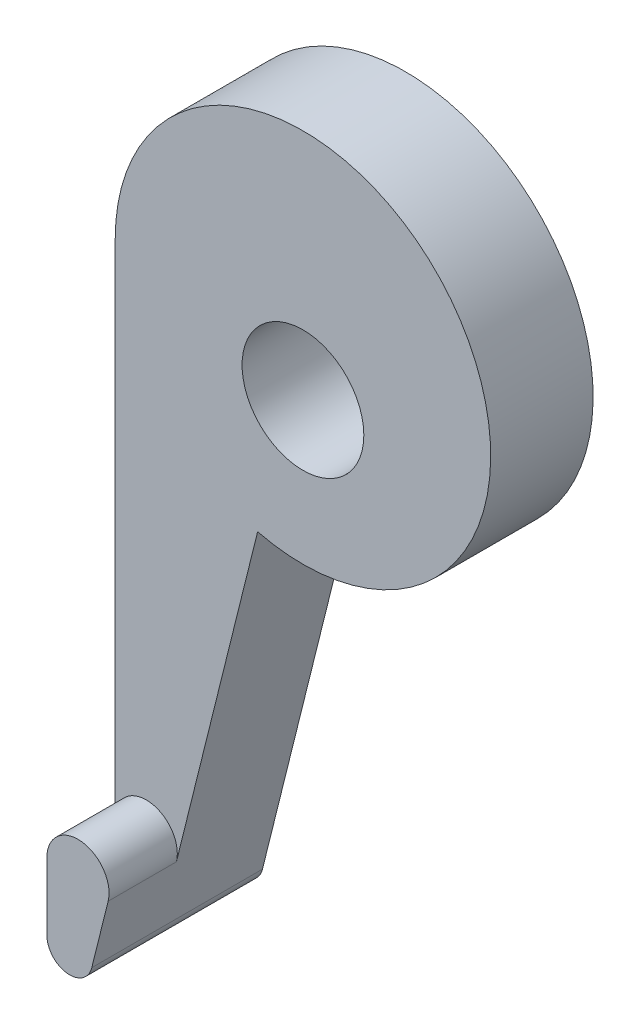
ISO-10303-21;
HEADER;
FILE_DESCRIPTION(('STEP AP214'),'2;1');
FILE_NAME('part.step','',(''),(''),'','','');
FILE_SCHEMA(('AUTOMOTIVE_DESIGN { 1 0 10303 214 1 1 1 1 }'));
ENDSEC;
DATA;
#1=APPLICATION_CONTEXT('core data for automotive mechanical design processes');
#2=APPLICATION_PROTOCOL_DEFINITION('international standard','automotive_design',2000,#1);
#3=PRODUCT_CONTEXT('',#1,'mechanical');
#4=PRODUCT('Part','Part','',(#3));
#5=PRODUCT_RELATED_PRODUCT_CATEGORY('part','',(#4));
#6=PRODUCT_DEFINITION_FORMATION('','',#4);
#7=PRODUCT_DEFINITION_CONTEXT('part definition',#1,'design');
#8=PRODUCT_DEFINITION('design','',#6,#7);
#9=PRODUCT_DEFINITION_SHAPE('','',#8);
#10=(LENGTH_UNIT() NAMED_UNIT(*) SI_UNIT(.MILLI.,.METRE.));
#11=(NAMED_UNIT(*) PLANE_ANGLE_UNIT() SI_UNIT($,.RADIAN.));
#12=(NAMED_UNIT(*) SI_UNIT($,.STERADIAN.) SOLID_ANGLE_UNIT());
#13=UNCERTAINTY_MEASURE_WITH_UNIT(LENGTH_MEASURE(1.E-05),#10,'distance_accuracy_value','');
#14=(GEOMETRIC_REPRESENTATION_CONTEXT(3) GLOBAL_UNCERTAINTY_ASSIGNED_CONTEXT((#13)) GLOBAL_UNIT_ASSIGNED_CONTEXT((#10,
#11,#12)) REPRESENTATION_CONTEXT('',''));
#15=CARTESIAN_POINT('',(0.,0.,0.));
#16=DIRECTION('',(0.,0.,1.));
#17=DIRECTION('',(1.,0.,0.));
#18=AXIS2_PLACEMENT_3D('',#15,#16,#17);
#19=CARTESIAN_POINT('',(9.58549901352955,8.51872549397017,4.5));
#20=DIRECTION('',(0.,0.,1.));
#21=DIRECTION('',(1.,0.,0.));
#22=AXIS2_PLACEMENT_3D('',#19,#20,#21);
#23=PLANE('',#22);
#24=CARTESIAN_POINT('',(2.70033985055056,-13.5035419519475,4.5));
#25=DIRECTION('',(0.,0.,1.));
#26=DIRECTION('',(-1.,0.,0.));
#27=AXIS2_PLACEMENT_3D('',#24,#25,#26);
#28=CIRCLE('',#27,1.36484083702101);
#29=CARTESIAN_POINT('',(4.02480904854268,-13.8330443858844,4.5));
#30=VERTEX_POINT('',#29);
#31=CARTESIAN_POINT('',(1.33549901352955,-13.5035419519475,4.5));
#32=VERTEX_POINT('',#31);
#33=EDGE_CURVE('E54',#30,#32,#28,.T.);
#34=ORIENTED_EDGE('',*,*,#33,.F.);
#35=DIRECTION('',(0.24142187499025,0.970420258587068,0.));
#36=VECTOR('',#35,1.);
#37=CARTESIAN_POINT('',(3.30591927211662,-16.7226963810201,4.5));
#38=LINE('',#37,#36);
#39=CARTESIAN_POINT('',(7.59376854485999,0.512758360626857,4.5));
#40=VERTEX_POINT('',#39);
#41=EDGE_CURVE('E59',#30,#40,#38,.T.);
#42=ORIENTED_EDGE('',*,*,#41,.T.);
#43=CARTESIAN_POINT('',(9.58549901352955,8.51872549397017,4.5));
#44=DIRECTION('',(0.,0.,1.));
#45=DIRECTION('',(1.,0.,0.));
#46=AXIS2_PLACEMENT_3D('',#43,#44,#45);
#47=CIRCLE('',#46,8.25);
#48=CARTESIAN_POINT('',(1.33549901352955,8.51872549397017,4.5));
#49=VERTEX_POINT('',#48);
#50=EDGE_CURVE('E90',#40,#49,#47,.T.);
#51=ORIENTED_EDGE('',*,*,#50,.T.);
#52=DIRECTION('',(0.,-1.,0.));
#53=VECTOR('',#52,1.);
#54=CARTESIAN_POINT('',(1.33549901352955,8.51872549397017,4.5));
#55=LINE('',#54,#53);
#56=EDGE_CURVE('E149',#49,#32,#55,.T.);
#57=ORIENTED_EDGE('',*,*,#56,.T.);
#58=EDGE_LOOP('',(#34,#42,#51,#57));
#59=FACE_BOUND('',#58,.T.);
#60=CARTESIAN_POINT('',(9.58549901352955,6.51872549397017,4.5));
#61=DIRECTION('',(0.,0.,1.));
#62=DIRECTION('',(1.,0.,0.));
#63=AXIS2_PLACEMENT_3D('',#60,#61,#62);
#64=CIRCLE('',#63,2.675);
#65=CARTESIAN_POINT('',(12.2604990135296,6.51872549397017,4.5));
#66=VERTEX_POINT('',#65);
#67=EDGE_CURVE('E101',#66,#66,#64,.T.);
#68=ORIENTED_EDGE('',*,*,#67,.F.);
#69=EDGE_LOOP('',(#68));
#70=FACE_BOUND('',#69,.T.);
#71=ADVANCED_FACE('F39',(#59,#70),#23,.T.);
#72=CARTESIAN_POINT('',(9.58549901352955,8.51872549397017,0.));
#73=DIRECTION('',(0.,0.,1.));
#74=DIRECTION('',(1.,0.,0.));
#75=AXIS2_PLACEMENT_3D('',#72,#73,#74);
#76=PLANE('',#75);
#77=CARTESIAN_POINT('',(9.58549901352955,8.51872549397017,0.));
#78=DIRECTION('',(0.,0.,1.));
#79=DIRECTION('',(1.,0.,0.));
#80=AXIS2_PLACEMENT_3D('',#77,#78,#79);
#81=CIRCLE('',#80,8.25);
#82=CARTESIAN_POINT('',(7.59376854485999,0.512758360626857,0.));
#83=VERTEX_POINT('',#82);
#84=CARTESIAN_POINT('',(1.33549901352955,8.51872549397017,0.));
#85=VERTEX_POINT('',#84);
#86=EDGE_CURVE('E96',#83,#85,#81,.T.);
#87=ORIENTED_EDGE('',*,*,#86,.F.);
#88=DIRECTION('',(0.24142187499025,0.970420258587068,0.));
#89=VECTOR('',#88,1.);
#90=CARTESIAN_POINT('',(3.30591927211662,-16.7226963810201,0.));
#91=LINE('',#90,#89);
#92=CARTESIAN_POINT('',(3.30591927211662,-16.7226963810201,0.));
#93=VERTEX_POINT('',#92);
#94=EDGE_CURVE('E79',#93,#83,#91,.T.);
#95=ORIENTED_EDGE('',*,*,#94,.F.);
#96=CARTESIAN_POINT('',(2.33549901352955,-16.4812745060298,0.));
#97=DIRECTION('',(0.,0.,1.));
#98=DIRECTION('',(1.,0.,0.));
#99=AXIS2_PLACEMENT_3D('',#96,#97,#98);
#100=CIRCLE('',#99,1.);
#101=CARTESIAN_POINT('',(1.33549901352955,-16.4812745060298,0.));
#102=VERTEX_POINT('',#101);
#103=EDGE_CURVE('E91',#102,#93,#100,.T.);
#104=ORIENTED_EDGE('',*,*,#103,.F.);
#105=DIRECTION('',(0.,-1.,0.));
#106=VECTOR('',#105,1.);
#107=CARTESIAN_POINT('',(1.33549901352955,8.51872549397017,0.));
#108=LINE('',#107,#106);
#109=EDGE_CURVE('E100',#85,#102,#108,.T.);
#110=ORIENTED_EDGE('',*,*,#109,.F.);
#111=EDGE_LOOP('',(#87,#95,#104,#110));
#112=FACE_BOUND('',#111,.T.);
#113=CARTESIAN_POINT('',(9.58549901352955,6.51872549397017,0.));
#114=DIRECTION('',(0.,0.,1.));
#115=DIRECTION('',(1.,0.,0.));
#116=AXIS2_PLACEMENT_3D('',#113,#114,#115);
#117=CIRCLE('',#116,2.675);
#118=CARTESIAN_POINT('',(12.2604990135296,6.51872549397017,0.));
#119=VERTEX_POINT('',#118);
#120=EDGE_CURVE('E105',#119,#119,#117,.T.);
#121=ORIENTED_EDGE('',*,*,#120,.T.);
#122=EDGE_LOOP('',(#121));
#123=FACE_BOUND('',#122,.T.);
#124=ADVANCED_FACE('F98',(#112,#123),#76,.F.);
#125=CARTESIAN_POINT('',(9.58549901352955,8.51872549397017,4.5));
#126=DIRECTION('',(0.,0.,-1.));
#127=DIRECTION('',(-1.,0.,0.));
#128=AXIS2_PLACEMENT_3D('',#125,#126,#127);
#129=CYLINDRICAL_SURFACE('',#128,8.25);
#130=ORIENTED_EDGE('',*,*,#86,.T.);
#131=DIRECTION('',(0.,0.,-1.));
#132=VECTOR('',#131,1.);
#133=CARTESIAN_POINT('',(1.33549901352955,8.51872549397017,4.5));
#134=LINE('',#133,#132);
#135=EDGE_CURVE('E11',#49,#85,#134,.T.);
#136=ORIENTED_EDGE('',*,*,#135,.F.);
#137=ORIENTED_EDGE('',*,*,#50,.F.);
#138=DIRECTION('',(0.,0.,-1.));
#139=VECTOR('',#138,1.);
#140=CARTESIAN_POINT('',(7.59376854485999,0.512758360626857,4.5));
#141=LINE('',#140,#139);
#142=EDGE_CURVE('E82',#40,#83,#141,.T.);
#143=ORIENTED_EDGE('',*,*,#142,.T.);
#144=EDGE_LOOP('',(#130,#136,#137,#143));
#145=FACE_BOUND('',#144,.T.);
#146=ADVANCED_FACE('F41',(#145),#129,.T.);
#147=CARTESIAN_POINT('',(1.33549901352955,8.51872549397017,4.5));
#148=DIRECTION('',(1.,0.,0.));
#149=DIRECTION('',(0.,1.,0.));
#150=AXIS2_PLACEMENT_3D('',#147,#148,#149);
#151=PLANE('',#150);
#152=ORIENTED_EDGE('',*,*,#109,.T.);
#153=DIRECTION('',(0.,0.,-1.));
#154=VECTOR('',#153,1.);
#155=CARTESIAN_POINT('',(1.33549901352955,-16.4812745060298,4.5));
#156=LINE('',#155,#154);
#157=CARTESIAN_POINT('',(1.33549901352955,-16.4812745060298,7.5));
#158=VERTEX_POINT('',#157);
#159=EDGE_CURVE('E47',#158,#102,#156,.T.);
#160=ORIENTED_EDGE('',*,*,#159,.F.);
#161=DIRECTION('',(0.,-1.,0.));
#162=VECTOR('',#161,1.);
#163=CARTESIAN_POINT('',(1.33549901352955,-13.5035419519475,7.5));
#164=LINE('',#163,#162);
#165=CARTESIAN_POINT('',(1.33549901352955,-13.5035419519475,7.5));
#166=VERTEX_POINT('',#165);
#167=EDGE_CURVE('E125',#166,#158,#164,.T.);
#168=ORIENTED_EDGE('',*,*,#167,.F.);
#169=DIRECTION('',(0.,0.,-1.));
#170=VECTOR('',#169,1.);
#171=CARTESIAN_POINT('',(1.33549901352955,-13.5035419519475,7.5));
#172=LINE('',#171,#170);
#173=EDGE_CURVE('E145',#166,#32,#172,.T.);
#174=ORIENTED_EDGE('',*,*,#173,.T.);
#175=ORIENTED_EDGE('',*,*,#56,.F.);
#176=ORIENTED_EDGE('',*,*,#135,.T.);
#177=EDGE_LOOP('',(#152,#160,#168,#174,#175,#176));
#178=FACE_BOUND('',#177,.T.);
#179=ADVANCED_FACE('F122',(#178),#151,.F.);
#180=CARTESIAN_POINT('',(2.33549901352955,-16.4812745060298,4.5));
#181=DIRECTION('',(0.,0.,-1.));
#182=DIRECTION('',(-1.,0.,0.));
#183=AXIS2_PLACEMENT_3D('',#180,#181,#182);
#184=CYLINDRICAL_SURFACE('',#183,1.);
#185=ORIENTED_EDGE('',*,*,#103,.T.);
#186=DIRECTION('',(0.,0.,-1.));
#187=VECTOR('',#186,1.);
#188=CARTESIAN_POINT('',(3.30591927211662,-16.7226963810201,4.5));
#189=LINE('',#188,#187);
#190=CARTESIAN_POINT('',(3.30591927211662,-16.7226963810201,7.5));
#191=VERTEX_POINT('',#190);
#192=EDGE_CURVE('E86',#191,#93,#189,.T.);
#193=ORIENTED_EDGE('',*,*,#192,.F.);
#194=CARTESIAN_POINT('',(2.33549901352955,-16.4812745060298,7.5));
#195=DIRECTION('',(0.,0.,1.));
#196=DIRECTION('',(1.,0.,0.));
#197=AXIS2_PLACEMENT_3D('',#194,#195,#196);
#198=CIRCLE('',#197,1.);
#199=EDGE_CURVE('E118',#158,#191,#198,.T.);
#200=ORIENTED_EDGE('',*,*,#199,.F.);
#201=ORIENTED_EDGE('',*,*,#159,.T.);
#202=EDGE_LOOP('',(#185,#193,#200,#201));
#203=FACE_BOUND('',#202,.T.);
#204=ADVANCED_FACE('F115',(#203),#184,.T.);
#205=CARTESIAN_POINT('',(3.30591927211662,-16.7226963810201,4.5));
#206=DIRECTION('',(-0.970420258587068,0.24142187499025,0.));
#207=DIRECTION('',(-0.24142187499025,-0.970420258587068,0.));
#208=AXIS2_PLACEMENT_3D('',#205,#206,#207);
#209=PLANE('',#208);
#210=ORIENTED_EDGE('',*,*,#94,.T.);
#211=ORIENTED_EDGE('',*,*,#142,.F.);
#212=ORIENTED_EDGE('',*,*,#41,.F.);
#213=DIRECTION('',(0.,0.,-1.));
#214=VECTOR('',#213,1.);
#215=CARTESIAN_POINT('',(4.02480904854268,-13.8330443858844,7.5));
#216=LINE('',#215,#214);
#217=CARTESIAN_POINT('',(4.02480904854268,-13.8330443858844,7.5));
#218=VERTEX_POINT('',#217);
#219=EDGE_CURVE('E141',#218,#30,#216,.T.);
#220=ORIENTED_EDGE('',*,*,#219,.F.);
#221=DIRECTION('',(0.241421874990249,0.970420258587068,0.));
#222=VECTOR('',#221,1.);
#223=CARTESIAN_POINT('',(3.30591927211662,-16.7226963810201,7.5));
#224=LINE('',#223,#222);
#225=EDGE_CURVE('E136',#191,#218,#224,.T.);
#226=ORIENTED_EDGE('',*,*,#225,.F.);
#227=ORIENTED_EDGE('',*,*,#192,.T.);
#228=EDGE_LOOP('',(#210,#211,#212,#220,#226,#227));
#229=FACE_BOUND('',#228,.T.);
#230=ADVANCED_FACE('F81',(#229),#209,.F.);
#231=CARTESIAN_POINT('',(9.58549901352955,6.51872549397017,4.5));
#232=DIRECTION('',(0.,0.,-1.));
#233=DIRECTION('',(-1.,0.,0.));
#234=AXIS2_PLACEMENT_3D('',#231,#232,#233);
#235=CYLINDRICAL_SURFACE('',#234,2.675);
#236=ORIENTED_EDGE('',*,*,#67,.T.);
#237=EDGE_LOOP('',(#236));
#238=FACE_BOUND('',#237,.T.);
#239=ORIENTED_EDGE('',*,*,#120,.F.);
#240=EDGE_LOOP('',(#239));
#241=FACE_BOUND('',#240,.T.);
#242=ADVANCED_FACE('F159',(#238,#241),#235,.F.);
#243=CARTESIAN_POINT('',(2.70033985055056,-13.5035419519475,7.5));
#244=DIRECTION('',(0.,0.,-1.));
#245=DIRECTION('',(-1.,0.,0.));
#246=AXIS2_PLACEMENT_3D('',#243,#244,#245);
#247=CYLINDRICAL_SURFACE('',#246,1.36484083702101);
#248=ORIENTED_EDGE('',*,*,#33,.T.);
#249=ORIENTED_EDGE('',*,*,#173,.F.);
#250=CARTESIAN_POINT('',(2.70033985055056,-13.5035419519475,7.5));
#251=DIRECTION('',(0.,0.,1.));
#252=DIRECTION('',(-1.,0.,0.));
#253=AXIS2_PLACEMENT_3D('',#250,#251,#252);
#254=CIRCLE('',#253,1.36484083702101);
#255=EDGE_CURVE('E133',#218,#166,#254,.T.);
#256=ORIENTED_EDGE('',*,*,#255,.F.);
#257=ORIENTED_EDGE('',*,*,#219,.T.);
#258=EDGE_LOOP('',(#248,#249,#256,#257));
#259=FACE_BOUND('',#258,.T.);
#260=ADVANCED_FACE('F153',(#259),#247,.T.);
#261=CARTESIAN_POINT('',(2.70033985055056,-13.5035419519475,7.5));
#262=DIRECTION('',(0.,0.,-1.));
#263=DIRECTION('',(-1.,0.,0.));
#264=AXIS2_PLACEMENT_3D('',#261,#262,#263);
#265=PLANE('',#264);
#266=ORIENTED_EDGE('',*,*,#255,.T.);
#267=ORIENTED_EDGE('',*,*,#167,.T.);
#268=ORIENTED_EDGE('',*,*,#199,.T.);
#269=ORIENTED_EDGE('',*,*,#225,.T.);
#270=EDGE_LOOP('',(#266,#267,#268,#269));
#271=FACE_BOUND('',#270,.T.);
#272=ADVANCED_FACE('F130',(#271),#265,.F.);
#273=CLOSED_SHELL('',(#71,#124,#146,#179,#204,#230,#242,#260,#272));
#274=MANIFOLD_SOLID_BREP('B2',#273);
#275=ADVANCED_BREP_SHAPE_REPRESENTATION('',(#18,#274),#14);
#276=SHAPE_DEFINITION_REPRESENTATION(#9,#275);
ENDSEC;
END-ISO-10303-21;
